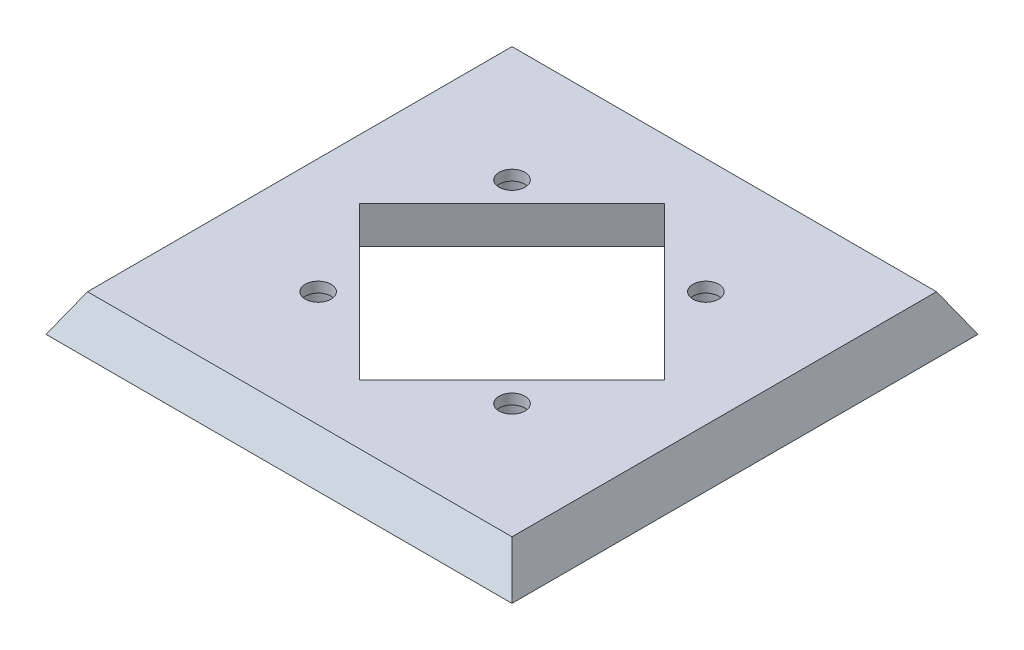
ISO-10303-21;
HEADER;
FILE_DESCRIPTION(('STEP AP214'),'2;1');
FILE_NAME('part.step','',(''),(''),'','','');
FILE_SCHEMA(('AUTOMOTIVE_DESIGN { 1 0 10303 214 1 1 1 1 }'));
ENDSEC;
DATA;
#1=APPLICATION_CONTEXT('core data for automotive mechanical design processes');
#2=APPLICATION_PROTOCOL_DEFINITION('international standard','automotive_design',2000,#1);
#3=PRODUCT_CONTEXT('',#1,'mechanical');
#4=PRODUCT('Part','Part','',(#3));
#5=PRODUCT_RELATED_PRODUCT_CATEGORY('part','',(#4));
#6=PRODUCT_DEFINITION_FORMATION('','',#4);
#7=PRODUCT_DEFINITION_CONTEXT('part definition',#1,'design');
#8=PRODUCT_DEFINITION('design','',#6,#7);
#9=PRODUCT_DEFINITION_SHAPE('','',#8);
#10=(LENGTH_UNIT() NAMED_UNIT(*) SI_UNIT(.MILLI.,.METRE.));
#11=(NAMED_UNIT(*) PLANE_ANGLE_UNIT() SI_UNIT($,.RADIAN.));
#12=(NAMED_UNIT(*) SI_UNIT($,.STERADIAN.) SOLID_ANGLE_UNIT());
#13=UNCERTAINTY_MEASURE_WITH_UNIT(LENGTH_MEASURE(1.E-05),#10,'distance_accuracy_value','');
#14=(GEOMETRIC_REPRESENTATION_CONTEXT(3) GLOBAL_UNCERTAINTY_ASSIGNED_CONTEXT((#13)) GLOBAL_UNIT_ASSIGNED_CONTEXT((#10,
#11,#12)) REPRESENTATION_CONTEXT('',''));
#15=CARTESIAN_POINT('',(0.,0.,0.));
#16=DIRECTION('',(0.,0.,1.));
#17=DIRECTION('',(1.,0.,0.));
#18=AXIS2_PLACEMENT_3D('',#15,#16,#17);
#19=CARTESIAN_POINT('',(-24.9999999999993,9.52499999999999,-24.9999999999993));
#20=DIRECTION('',(0.,-1.,0.));
#21=DIRECTION('',(0.,0.,-1.));
#22=AXIS2_PLACEMENT_3D('',#19,#20,#21);
#23=CYLINDRICAL_SURFACE('',#22,3.34);
#24=CARTESIAN_POINT('',(-24.9999999999993,9.52499999999999,-24.9999999999993));
#25=DIRECTION('',(0.,1.,0.));
#26=DIRECTION('',(0.,0.,1.));
#27=AXIS2_PLACEMENT_3D('',#24,#25,#26);
#28=CIRCLE('',#27,3.34);
#29=CARTESIAN_POINT('',(-24.9999999999993,9.52499999999999,-21.6599999999993));
#30=VERTEX_POINT('',#29);
#31=EDGE_CURVE('E124',#30,#30,#28,.T.);
#32=ORIENTED_EDGE('',*,*,#31,.T.);
#33=EDGE_LOOP('',(#32));
#34=FACE_BOUND('',#33,.T.);
#35=CARTESIAN_POINT('',(-24.9999999999993,6.858,-24.9999999999993));
#36=DIRECTION('',(0.,-1.,0.));
#37=DIRECTION('',(0.,0.,-1.));
#38=AXIS2_PLACEMENT_3D('',#35,#36,#37);
#39=CIRCLE('',#38,3.34);
#40=CARTESIAN_POINT('',(-24.9999999999993,6.858,-28.3399999999993));
#41=VERTEX_POINT('',#40);
#42=EDGE_CURVE('E45',#41,#41,#39,.T.);
#43=ORIENTED_EDGE('',*,*,#42,.T.);
#44=EDGE_LOOP('',(#43));
#45=FACE_BOUND('',#44,.T.);
#46=ADVANCED_FACE('F41',(#34,#45),#23,.F.);
#47=CARTESIAN_POINT('',(-24.9999999999979,9.52499999999999,25.0000000000007));
#48=DIRECTION('',(0.,-1.,0.));
#49=DIRECTION('',(0.,0.,-1.));
#50=AXIS2_PLACEMENT_3D('',#47,#48,#49);
#51=CYLINDRICAL_SURFACE('',#50,3.34);
#52=CARTESIAN_POINT('',(-24.9999999999979,9.52499999999999,25.0000000000007));
#53=DIRECTION('',(0.,1.,0.));
#54=DIRECTION('',(0.,0.,1.));
#55=AXIS2_PLACEMENT_3D('',#52,#53,#54);
#56=CIRCLE('',#55,3.34);
#57=CARTESIAN_POINT('',(-24.9999999999979,9.52499999999999,28.3400000000007));
#58=VERTEX_POINT('',#57);
#59=EDGE_CURVE('E187',#58,#58,#56,.T.);
#60=ORIENTED_EDGE('',*,*,#59,.T.);
#61=EDGE_LOOP('',(#60));
#62=FACE_BOUND('',#61,.T.);
#63=CARTESIAN_POINT('',(-24.9999999999979,6.858,25.0000000000007));
#64=DIRECTION('',(0.,-1.,0.));
#65=DIRECTION('',(0.,0.,-1.));
#66=AXIS2_PLACEMENT_3D('',#63,#64,#65);
#67=CIRCLE('',#66,3.34);
#68=CARTESIAN_POINT('',(-24.9999999999979,6.858,21.6600000000007));
#69=VERTEX_POINT('',#68);
#70=EDGE_CURVE('E182',#69,#69,#67,.T.);
#71=ORIENTED_EDGE('',*,*,#70,.T.);
#72=EDGE_LOOP('',(#71));
#73=FACE_BOUND('',#72,.T.);
#74=ADVANCED_FACE('F219',(#62,#73),#51,.F.);
#75=CARTESIAN_POINT('',(25.0000000000021,9.52499999999999,24.9999999999993));
#76=DIRECTION('',(0.,-1.,0.));
#77=DIRECTION('',(0.,0.,-1.));
#78=AXIS2_PLACEMENT_3D('',#75,#76,#77);
#79=CYLINDRICAL_SURFACE('',#78,3.34);
#80=CARTESIAN_POINT('',(25.0000000000021,9.52499999999999,24.9999999999993));
#81=DIRECTION('',(0.,1.,0.));
#82=DIRECTION('',(0.,0.,1.));
#83=AXIS2_PLACEMENT_3D('',#80,#81,#82);
#84=CIRCLE('',#83,3.34);
#85=CARTESIAN_POINT('',(25.0000000000021,9.52499999999999,28.3399999999993));
#86=VERTEX_POINT('',#85);
#87=EDGE_CURVE('E191',#86,#86,#84,.T.);
#88=ORIENTED_EDGE('',*,*,#87,.T.);
#89=EDGE_LOOP('',(#88));
#90=FACE_BOUND('',#89,.T.);
#91=CARTESIAN_POINT('',(25.0000000000021,6.858,24.9999999999993));
#92=DIRECTION('',(0.,-1.,0.));
#93=DIRECTION('',(0.,0.,-1.));
#94=AXIS2_PLACEMENT_3D('',#91,#92,#93);
#95=CIRCLE('',#94,3.34);
#96=CARTESIAN_POINT('',(25.0000000000021,6.858,21.6599999999993));
#97=VERTEX_POINT('',#96);
#98=EDGE_CURVE('E179',#97,#97,#95,.T.);
#99=ORIENTED_EDGE('',*,*,#98,.T.);
#100=EDGE_LOOP('',(#99));
#101=FACE_BOUND('',#100,.T.);
#102=ADVANCED_FACE('F226',(#90,#101),#79,.F.);
#103=CARTESIAN_POINT('',(25.0000000000007,9.52499999999999,-25.0000000000007));
#104=DIRECTION('',(0.,-1.,0.));
#105=DIRECTION('',(0.,0.,-1.));
#106=AXIS2_PLACEMENT_3D('',#103,#104,#105);
#107=CYLINDRICAL_SURFACE('',#106,3.34);
#108=CARTESIAN_POINT('',(25.0000000000007,9.52499999999999,-25.0000000000007));
#109=DIRECTION('',(0.,1.,0.));
#110=DIRECTION('',(0.,0.,1.));
#111=AXIS2_PLACEMENT_3D('',#108,#109,#110);
#112=CIRCLE('',#111,3.34);
#113=CARTESIAN_POINT('',(25.0000000000007,9.52499999999999,-21.6600000000007));
#114=VERTEX_POINT('',#113);
#115=EDGE_CURVE('E138',#114,#114,#112,.T.);
#116=ORIENTED_EDGE('',*,*,#115,.T.);
#117=EDGE_LOOP('',(#116));
#118=FACE_BOUND('',#117,.T.);
#119=CARTESIAN_POINT('',(25.0000000000007,6.858,-25.0000000000007));
#120=DIRECTION('',(0.,-1.,0.));
#121=DIRECTION('',(0.,0.,-1.));
#122=AXIS2_PLACEMENT_3D('',#119,#120,#121);
#123=CIRCLE('',#122,3.34);
#124=CARTESIAN_POINT('',(25.0000000000007,6.858,-28.3400000000007));
#125=VERTEX_POINT('',#124);
#126=EDGE_CURVE('E176',#125,#125,#123,.T.);
#127=ORIENTED_EDGE('',*,*,#126,.T.);
#128=EDGE_LOOP('',(#127));
#129=FACE_BOUND('',#128,.T.);
#130=ADVANCED_FACE('F201',(#118,#129),#107,.F.);
#131=CARTESIAN_POINT('',(-60.1,-1.94289029309402E-13,60.1));
#132=DIRECTION('',(0.,0.489717903709931,0.871880940717224));
#133=DIRECTION('',(0.,-0.871880940717224,0.489717903709931));
#134=AXIS2_PLACEMENT_3D('',#131,#132,#133);
#135=PLANE('',#134);
#136=DIRECTION('',(0.43981093998604,0.783027888479835,-0.439810939986044));
#137=VECTOR('',#136,1.);
#138=CARTESIAN_POINT('',(-60.1,-1.94289029309402E-13,60.1));
#139=LINE('',#138,#137);
#140=CARTESIAN_POINT('',(-60.1,-1.94289029309402E-13,60.1));
#141=VERTEX_POINT('',#140);
#142=CARTESIAN_POINT('',(-54.75,9.52499999999999,54.75));
#143=VERTEX_POINT('',#142);
#144=EDGE_CURVE('E161',#141,#143,#139,.T.);
#145=ORIENTED_EDGE('',*,*,#144,.F.);
#146=DIRECTION('',(1.,0.,0.));
#147=VECTOR('',#146,1.);
#148=CARTESIAN_POINT('',(-60.1,-1.94289029309402E-13,60.1));
#149=LINE('',#148,#147);
#150=CARTESIAN_POINT('',(60.1,-1.94289029309402E-13,60.1));
#151=VERTEX_POINT('',#150);
#152=EDGE_CURVE('E167',#141,#151,#149,.T.);
#153=ORIENTED_EDGE('',*,*,#152,.T.);
#154=DIRECTION('',(0.43981093998604,-0.783027888479835,0.439810939986044));
#155=VECTOR('',#154,1.);
#156=CARTESIAN_POINT('',(36.8492737156452,41.3949846464454,36.849273715645));
#157=LINE('',#156,#155);
#158=CARTESIAN_POINT('',(54.75,9.52499999999999,54.75));
#159=VERTEX_POINT('',#158);
#160=EDGE_CURVE('E157',#159,#151,#157,.T.);
#161=ORIENTED_EDGE('',*,*,#160,.F.);
#162=DIRECTION('',(1.,0.,0.));
#163=VECTOR('',#162,1.);
#164=CARTESIAN_POINT('',(-60.1,9.52499999999999,54.75));
#165=LINE('',#164,#163);
#166=EDGE_CURVE('E11',#143,#159,#165,.T.);
#167=ORIENTED_EDGE('',*,*,#166,.F.);
#168=EDGE_LOOP('',(#145,#153,#161,#167));
#169=FACE_BOUND('',#168,.T.);
#170=ADVANCED_FACE('F43',(#169),#135,.T.);
#171=CARTESIAN_POINT('',(-60.1,9.52499999999999,54.75));
#172=DIRECTION('',(0.,1.,0.));
#173=DIRECTION('',(0.,0.,1.));
#174=AXIS2_PLACEMENT_3D('',#171,#172,#173);
#175=PLANE('',#174);
#176=ORIENTED_EDGE('',*,*,#115,.F.);
#177=EDGE_LOOP('',(#176));
#178=FACE_BOUND('',#177,.T.);
#179=DIRECTION('',(0.707106781186548,0.,-0.707106781186548));
#180=VECTOR('',#179,1.);
#181=CARTESIAN_POINT('',(0.,9.52499999999999,39.3575634408432));
#182=LINE('',#181,#180);
#183=CARTESIAN_POINT('',(0.,9.52499999999999,39.3575634408432));
#184=VERTEX_POINT('',#183);
#185=CARTESIAN_POINT('',(39.3575634408432,9.52499999999999,0.));
#186=VERTEX_POINT('',#185);
#187=EDGE_CURVE('E116',#184,#186,#182,.T.);
#188=ORIENTED_EDGE('',*,*,#187,.F.);
#189=DIRECTION('',(0.707106781186548,0.,0.707106781186548));
#190=VECTOR('',#189,1.);
#191=CARTESIAN_POINT('',(-39.3575634408432,9.52499999999999,0.));
#192=LINE('',#191,#190);
#193=CARTESIAN_POINT('',(-39.3575634408432,9.52499999999999,0.));
#194=VERTEX_POINT('',#193);
#195=EDGE_CURVE('E108',#194,#184,#192,.T.);
#196=ORIENTED_EDGE('',*,*,#195,.F.);
#197=DIRECTION('',(-0.707106781186548,0.,0.707106781186547));
#198=VECTOR('',#197,1.);
#199=CARTESIAN_POINT('',(-39.3575634408432,9.52499999999999,0.));
#200=LINE('',#199,#198);
#201=CARTESIAN_POINT('',(0.,9.52499999999999,-39.3575634408432));
#202=VERTEX_POINT('',#201);
#203=EDGE_CURVE('E132',#202,#194,#200,.T.);
#204=ORIENTED_EDGE('',*,*,#203,.F.);
#205=DIRECTION('',(-0.707106781186548,0.,-0.707106781186547));
#206=VECTOR('',#205,1.);
#207=CARTESIAN_POINT('',(0.,9.52499999999999,-39.3575634408432));
#208=LINE('',#207,#206);
#209=EDGE_CURVE('E130',#186,#202,#208,.T.);
#210=ORIENTED_EDGE('',*,*,#209,.F.);
#211=EDGE_LOOP('',(#188,#196,#204,#210));
#212=FACE_BOUND('',#211,.T.);
#213=ORIENTED_EDGE('',*,*,#87,.F.);
#214=EDGE_LOOP('',(#213));
#215=FACE_BOUND('',#214,.T.);
#216=ORIENTED_EDGE('',*,*,#59,.F.);
#217=EDGE_LOOP('',(#216));
#218=FACE_BOUND('',#217,.T.);
#219=ORIENTED_EDGE('',*,*,#31,.F.);
#220=EDGE_LOOP('',(#219));
#221=FACE_BOUND('',#220,.T.);
#222=DIRECTION('',(0.,0.,1.));
#223=VECTOR('',#222,1.);
#224=CARTESIAN_POINT('',(-54.75,9.52499999999999,-60.1));
#225=LINE('',#224,#223);
#226=CARTESIAN_POINT('',(-54.75,9.52499999999999,-54.75));
#227=VERTEX_POINT('',#226);
#228=EDGE_CURVE('E151',#227,#143,#225,.T.);
#229=ORIENTED_EDGE('',*,*,#228,.T.);
#230=ORIENTED_EDGE('',*,*,#166,.T.);
#231=DIRECTION('',(0.,0.,1.));
#232=VECTOR('',#231,1.);
#233=CARTESIAN_POINT('',(54.75,9.52499999999999,-60.1));
#234=LINE('',#233,#232);
#235=CARTESIAN_POINT('',(54.75,9.52499999999999,-54.75));
#236=VERTEX_POINT('',#235);
#237=EDGE_CURVE('E150',#236,#159,#234,.T.);
#238=ORIENTED_EDGE('',*,*,#237,.F.);
#239=DIRECTION('',(1.,0.,0.));
#240=VECTOR('',#239,1.);
#241=CARTESIAN_POINT('',(-60.1,9.52499999999999,-54.75));
#242=LINE('',#241,#240);
#243=EDGE_CURVE('E50',#227,#236,#242,.T.);
#244=ORIENTED_EDGE('',*,*,#243,.F.);
#245=EDGE_LOOP('',(#229,#230,#238,#244));
#246=FACE_BOUND('',#245,.T.);
#247=ADVANCED_FACE('F128',(#178,#212,#215,#218,#221,#246),#175,.T.);
#248=CARTESIAN_POINT('',(-60.1,9.52499999999999,-54.75));
#249=DIRECTION('',(0.,0.489717903709931,-0.871880940717224));
#250=DIRECTION('',(0.,0.871880940717224,0.489717903709931));
#251=AXIS2_PLACEMENT_3D('',#248,#249,#250);
#252=PLANE('',#251);
#253=DIRECTION('',(-0.43981093998604,-0.783027888479835,-0.439810939986044));
#254=VECTOR('',#253,1.);
#255=CARTESIAN_POINT('',(-55.784870096683,7.68254436057832,-55.784870096683));
#256=LINE('',#255,#254);
#257=CARTESIAN_POINT('',(-60.1,-1.94289029309402E-13,-60.1));
#258=VERTEX_POINT('',#257);
#259=EDGE_CURVE('E159',#227,#258,#256,.T.);
#260=ORIENTED_EDGE('',*,*,#259,.F.);
#261=ORIENTED_EDGE('',*,*,#243,.T.);
#262=DIRECTION('',(-0.43981093998604,0.783027888479835,0.439810939986044));
#263=VECTOR('',#262,1.);
#264=CARTESIAN_POINT('',(32.5341438123282,49.0775290070239,-32.534143812328));
#265=LINE('',#264,#263);
#266=CARTESIAN_POINT('',(60.1,-1.94289029309402E-13,-60.1));
#267=VERTEX_POINT('',#266);
#268=EDGE_CURVE('E154',#267,#236,#265,.T.);
#269=ORIENTED_EDGE('',*,*,#268,.F.);
#270=DIRECTION('',(1.,0.,0.));
#271=VECTOR('',#270,1.);
#272=CARTESIAN_POINT('',(-60.1,-1.94289029309402E-13,-60.1));
#273=LINE('',#272,#271);
#274=EDGE_CURVE('E171',#258,#267,#273,.T.);
#275=ORIENTED_EDGE('',*,*,#274,.F.);
#276=EDGE_LOOP('',(#260,#261,#269,#275));
#277=FACE_BOUND('',#276,.T.);
#278=ADVANCED_FACE('F205',(#277),#252,.T.);
#279=CARTESIAN_POINT('',(-60.1,-1.94289029309402E-13,-60.1));
#280=DIRECTION('',(0.,-1.,0.));
#281=DIRECTION('',(0.,0.,-1.));
#282=AXIS2_PLACEMENT_3D('',#279,#280,#281);
#283=PLANE('',#282);
#284=CARTESIAN_POINT('',(-25.000000000001,0.,-24.9999999999976));
#285=DIRECTION('',(0.,-1.,0.));
#286=DIRECTION('',(0.,0.,-1.));
#287=AXIS2_PLACEMENT_3D('',#284,#285,#286);
#288=CIRCLE('',#287,5.08);
#289=CARTESIAN_POINT('',(-25.000000000001,0.,-30.0799999999976));
#290=VERTEX_POINT('',#289);
#291=EDGE_CURVE('E259',#290,#290,#288,.T.);
#292=ORIENTED_EDGE('',*,*,#291,.F.);
#293=EDGE_LOOP('',(#292));
#294=FACE_BOUND('',#293,.T.);
#295=CARTESIAN_POINT('',(24.9999999999977,0.,-25.0000000000009));
#296=DIRECTION('',(0.,-1.,0.));
#297=DIRECTION('',(0.,0.,-1.));
#298=AXIS2_PLACEMENT_3D('',#295,#296,#297);
#299=CIRCLE('',#298,5.08);
#300=CARTESIAN_POINT('',(24.9999999999977,0.,-30.0800000000009));
#301=VERTEX_POINT('',#300);
#302=EDGE_CURVE('E263',#301,#301,#299,.T.);
#303=ORIENTED_EDGE('',*,*,#302,.F.);
#304=EDGE_LOOP('',(#303));
#305=FACE_BOUND('',#304,.T.);
#306=CARTESIAN_POINT('',(25.0000000000008,0.,24.9999999999978));
#307=DIRECTION('',(0.,-1.,0.));
#308=DIRECTION('',(0.,0.,-1.));
#309=AXIS2_PLACEMENT_3D('',#306,#307,#308);
#310=CIRCLE('',#309,5.08);
#311=CARTESIAN_POINT('',(25.0000000000008,0.,19.9199999999978));
#312=VERTEX_POINT('',#311);
#313=EDGE_CURVE('E267',#312,#312,#310,.T.);
#314=ORIENTED_EDGE('',*,*,#313,.F.);
#315=EDGE_LOOP('',(#314));
#316=FACE_BOUND('',#315,.T.);
#317=CARTESIAN_POINT('',(-24.9999999999979,0.,25.0000000000007));
#318=DIRECTION('',(0.,-1.,0.));
#319=DIRECTION('',(0.,0.,-1.));
#320=AXIS2_PLACEMENT_3D('',#317,#318,#319);
#321=CIRCLE('',#320,5.08);
#322=CARTESIAN_POINT('',(-24.9999999999979,0.,19.9200000000007));
#323=VERTEX_POINT('',#322);
#324=EDGE_CURVE('E271',#323,#323,#321,.T.);
#325=ORIENTED_EDGE('',*,*,#324,.F.);
#326=EDGE_LOOP('',(#325));
#327=FACE_BOUND('',#326,.T.);
#328=DIRECTION('',(-0.707106781186548,0.,0.707106781186547));
#329=VECTOR('',#328,1.);
#330=CARTESIAN_POINT('',(-39.3575634408432,0.,0.));
#331=LINE('',#330,#329);
#332=CARTESIAN_POINT('',(0.,0.,-39.3575634408432));
#333=VERTEX_POINT('',#332);
#334=CARTESIAN_POINT('',(-39.3575634408432,-1.94289029309402E-13,0.));
#335=VERTEX_POINT('',#334);
#336=EDGE_CURVE('E117',#333,#335,#331,.T.);
#337=ORIENTED_EDGE('',*,*,#336,.T.);
#338=DIRECTION('',(0.707106781186548,0.,0.707106781186548));
#339=VECTOR('',#338,1.);
#340=CARTESIAN_POINT('',(-39.3575634408432,0.,0.));
#341=LINE('',#340,#339);
#342=CARTESIAN_POINT('',(0.,0.,39.3575634408432));
#343=VERTEX_POINT('',#342);
#344=EDGE_CURVE('E66',#335,#343,#341,.T.);
#345=ORIENTED_EDGE('',*,*,#344,.T.);
#346=DIRECTION('',(0.707106781186548,0.,-0.707106781186548));
#347=VECTOR('',#346,1.);
#348=CARTESIAN_POINT('',(0.,0.,39.3575634408432));
#349=LINE('',#348,#347);
#350=CARTESIAN_POINT('',(39.3575634408432,0.,0.));
#351=VERTEX_POINT('',#350);
#352=EDGE_CURVE('E123',#343,#351,#349,.T.);
#353=ORIENTED_EDGE('',*,*,#352,.T.);
#354=DIRECTION('',(-0.707106781186548,0.,-0.707106781186547));
#355=VECTOR('',#354,1.);
#356=CARTESIAN_POINT('',(0.,0.,-39.3575634408432));
#357=LINE('',#356,#355);
#358=EDGE_CURVE('E140',#351,#333,#357,.T.);
#359=ORIENTED_EDGE('',*,*,#358,.T.);
#360=EDGE_LOOP('',(#337,#345,#353,#359));
#361=FACE_BOUND('',#360,.T.);
#362=ORIENTED_EDGE('',*,*,#274,.T.);
#363=DIRECTION('',(0.,0.,-1.));
#364=VECTOR('',#363,1.);
#365=CARTESIAN_POINT('',(60.1,-1.94289029309402E-13,-60.1));
#366=LINE('',#365,#364);
#367=EDGE_CURVE('E163',#151,#267,#366,.T.);
#368=ORIENTED_EDGE('',*,*,#367,.F.);
#369=ORIENTED_EDGE('',*,*,#152,.F.);
#370=DIRECTION('',(0.,0.,-1.));
#371=VECTOR('',#370,1.);
#372=CARTESIAN_POINT('',(-60.1,-1.94289029309402E-13,-60.1));
#373=LINE('',#372,#371);
#374=EDGE_CURVE('E165',#141,#258,#373,.T.);
#375=ORIENTED_EDGE('',*,*,#374,.T.);
#376=EDGE_LOOP('',(#362,#368,#369,#375));
#377=FACE_BOUND('',#376,.T.);
#378=ADVANCED_FACE('F212',(#294,#305,#316,#327,#361,#377),#283,.T.);
#379=CARTESIAN_POINT('',(54.75,9.52499999999999,-60.1));
#380=DIRECTION('',(-0.871880940717225,-0.489717903709928,0.));
#381=DIRECTION('',(0.489717903709928,-0.871880940717225,0.));
#382=AXIS2_PLACEMENT_3D('',#379,#380,#381);
#383=PLANE('',#382);
#384=ORIENTED_EDGE('',*,*,#160,.T.);
#385=ORIENTED_EDGE('',*,*,#367,.T.);
#386=ORIENTED_EDGE('',*,*,#268,.T.);
#387=ORIENTED_EDGE('',*,*,#237,.T.);
#388=EDGE_LOOP('',(#384,#385,#386,#387));
#389=FACE_BOUND('',#388,.T.);
#390=ADVANCED_FACE('F232',(#389),#383,.F.);
#391=CARTESIAN_POINT('',(-54.75,9.52499999999999,-60.1));
#392=DIRECTION('',(0.871880940717225,-0.489717903709928,0.));
#393=DIRECTION('',(0.489717903709928,0.871880940717225,0.));
#394=AXIS2_PLACEMENT_3D('',#391,#392,#393);
#395=PLANE('',#394);
#396=ORIENTED_EDGE('',*,*,#144,.T.);
#397=ORIENTED_EDGE('',*,*,#228,.F.);
#398=ORIENTED_EDGE('',*,*,#259,.T.);
#399=ORIENTED_EDGE('',*,*,#374,.F.);
#400=EDGE_LOOP('',(#396,#397,#398,#399));
#401=FACE_BOUND('',#400,.T.);
#402=ADVANCED_FACE('F231',(#401),#395,.F.);
#403=CARTESIAN_POINT('',(-39.3575634408432,9.52499999999999,0.));
#404=DIRECTION('',(0.707106781186547,0.,-0.707106781186547));
#405=DIRECTION('',(-0.707106781186548,0.,-0.707106781186547));
#406=AXIS2_PLACEMENT_3D('',#403,#404,#405);
#407=PLANE('',#406);
#408=ORIENTED_EDGE('',*,*,#344,.F.);
#409=DIRECTION('',(0.,-1.,0.));
#410=VECTOR('',#409,1.);
#411=CARTESIAN_POINT('',(-39.3575634408432,9.52499999999999,0.));
#412=LINE('',#411,#410);
#413=EDGE_CURVE('E112',#194,#335,#412,.T.);
#414=ORIENTED_EDGE('',*,*,#413,.F.);
#415=ORIENTED_EDGE('',*,*,#195,.T.);
#416=DIRECTION('',(0.,-1.,0.));
#417=VECTOR('',#416,1.);
#418=CARTESIAN_POINT('',(0.,9.52499999999999,39.3575634408432));
#419=LINE('',#418,#417);
#420=EDGE_CURVE('E111',#184,#343,#419,.T.);
#421=ORIENTED_EDGE('',*,*,#420,.T.);
#422=EDGE_LOOP('',(#408,#414,#415,#421));
#423=FACE_BOUND('',#422,.T.);
#424=ADVANCED_FACE('F110',(#423),#407,.T.);
#425=CARTESIAN_POINT('',(0.,9.52499999999999,39.3575634408432));
#426=DIRECTION('',(-0.707106781186548,0.,-0.707106781186548));
#427=DIRECTION('',(-0.707106781186548,0.,0.707106781186548));
#428=AXIS2_PLACEMENT_3D('',#425,#426,#427);
#429=PLANE('',#428);
#430=ORIENTED_EDGE('',*,*,#352,.F.);
#431=ORIENTED_EDGE('',*,*,#420,.F.);
#432=ORIENTED_EDGE('',*,*,#187,.T.);
#433=DIRECTION('',(0.,-1.,0.));
#434=VECTOR('',#433,1.);
#435=CARTESIAN_POINT('',(39.3575634408432,9.52499999999999,0.));
#436=LINE('',#435,#434);
#437=EDGE_CURVE('E125',#186,#351,#436,.T.);
#438=ORIENTED_EDGE('',*,*,#437,.T.);
#439=EDGE_LOOP('',(#430,#431,#432,#438));
#440=FACE_BOUND('',#439,.T.);
#441=ADVANCED_FACE('F120',(#440),#429,.T.);
#442=CARTESIAN_POINT('',(0.,9.52499999999999,-39.3575634408432));
#443=DIRECTION('',(-0.707106781186547,0.,0.707106781186548));
#444=DIRECTION('',(0.707106781186548,0.,0.707106781186547));
#445=AXIS2_PLACEMENT_3D('',#442,#443,#444);
#446=PLANE('',#445);
#447=ORIENTED_EDGE('',*,*,#358,.F.);
#448=ORIENTED_EDGE('',*,*,#437,.F.);
#449=ORIENTED_EDGE('',*,*,#209,.T.);
#450=DIRECTION('',(0.,-1.,0.));
#451=VECTOR('',#450,1.);
#452=CARTESIAN_POINT('',(0.,9.52499999999999,-39.3575634408432));
#453=LINE('',#452,#451);
#454=EDGE_CURVE('E58',#202,#333,#453,.T.);
#455=ORIENTED_EDGE('',*,*,#454,.T.);
#456=EDGE_LOOP('',(#447,#448,#449,#455));
#457=FACE_BOUND('',#456,.T.);
#458=ADVANCED_FACE('F275',(#457),#446,.T.);
#459=CARTESIAN_POINT('',(-39.3575634408432,9.52499999999999,0.));
#460=DIRECTION('',(0.707106781186547,0.,0.707106781186548));
#461=DIRECTION('',(0.707106781186548,0.,-0.707106781186547));
#462=AXIS2_PLACEMENT_3D('',#459,#460,#461);
#463=PLANE('',#462);
#464=ORIENTED_EDGE('',*,*,#336,.F.);
#465=ORIENTED_EDGE('',*,*,#454,.F.);
#466=ORIENTED_EDGE('',*,*,#203,.T.);
#467=ORIENTED_EDGE('',*,*,#413,.T.);
#468=EDGE_LOOP('',(#464,#465,#466,#467));
#469=FACE_BOUND('',#468,.T.);
#470=ADVANCED_FACE('F273',(#469),#463,.T.);
#471=CARTESIAN_POINT('',(24.9999999999977,6.858,-25.0000000000009));
#472=DIRECTION('',(0.,-1.,0.));
#473=DIRECTION('',(0.,0.,-1.));
#474=AXIS2_PLACEMENT_3D('',#471,#472,#473);
#475=CYLINDRICAL_SURFACE('',#474,5.08);
#476=CARTESIAN_POINT('',(24.9999999999977,6.858,-25.0000000000009));
#477=DIRECTION('',(0.,-1.,0.));
#478=DIRECTION('',(0.,0.,-1.));
#479=AXIS2_PLACEMENT_3D('',#476,#477,#478);
#480=CIRCLE('',#479,5.08);
#481=CARTESIAN_POINT('',(24.9999999999977,6.858,-30.0800000000009));
#482=VERTEX_POINT('',#481);
#483=EDGE_CURVE('E401',#482,#482,#480,.T.);
#484=ORIENTED_EDGE('',*,*,#483,.F.);
#485=EDGE_LOOP('',(#484));
#486=FACE_BOUND('',#485,.T.);
#487=ORIENTED_EDGE('',*,*,#302,.T.);
#488=EDGE_LOOP('',(#487));
#489=FACE_BOUND('',#488,.T.);
#490=ADVANCED_FACE('F274',(#486,#489),#475,.F.);
#491=CARTESIAN_POINT('',(24.9999999999977,6.858,-25.0000000000009));
#492=DIRECTION('',(0.,-1.,0.));
#493=DIRECTION('',(0.,0.,-1.));
#494=AXIS2_PLACEMENT_3D('',#491,#492,#493);
#495=PLANE('',#494);
#496=ORIENTED_EDGE('',*,*,#126,.F.);
#497=EDGE_LOOP('',(#496));
#498=FACE_BOUND('',#497,.T.);
#499=ORIENTED_EDGE('',*,*,#483,.T.);
#500=EDGE_LOOP('',(#499));
#501=FACE_BOUND('',#500,.T.);
#502=ADVANCED_FACE('F280',(#498,#501),#495,.T.);
#503=CARTESIAN_POINT('',(25.0000000000008,6.858,24.9999999999978));
#504=DIRECTION('',(0.,-1.,0.));
#505=DIRECTION('',(0.,0.,-1.));
#506=AXIS2_PLACEMENT_3D('',#503,#504,#505);
#507=CYLINDRICAL_SURFACE('',#506,5.08);
#508=CARTESIAN_POINT('',(25.0000000000008,6.858,24.9999999999978));
#509=DIRECTION('',(0.,-1.,0.));
#510=DIRECTION('',(0.,0.,-1.));
#511=AXIS2_PLACEMENT_3D('',#508,#509,#510);
#512=CIRCLE('',#511,5.08);
#513=CARTESIAN_POINT('',(25.0000000000008,6.858,19.9199999999978));
#514=VERTEX_POINT('',#513);
#515=EDGE_CURVE('E407',#514,#514,#512,.T.);
#516=ORIENTED_EDGE('',*,*,#515,.F.);
#517=EDGE_LOOP('',(#516));
#518=FACE_BOUND('',#517,.T.);
#519=ORIENTED_EDGE('',*,*,#313,.T.);
#520=EDGE_LOOP('',(#519));
#521=FACE_BOUND('',#520,.T.);
#522=ADVANCED_FACE('F333',(#518,#521),#507,.F.);
#523=CARTESIAN_POINT('',(25.0000000000008,6.858,24.9999999999978));
#524=DIRECTION('',(0.,-1.,0.));
#525=DIRECTION('',(0.,0.,-1.));
#526=AXIS2_PLACEMENT_3D('',#523,#524,#525);
#527=PLANE('',#526);
#528=ORIENTED_EDGE('',*,*,#98,.F.);
#529=EDGE_LOOP('',(#528));
#530=FACE_BOUND('',#529,.T.);
#531=ORIENTED_EDGE('',*,*,#515,.T.);
#532=EDGE_LOOP('',(#531));
#533=FACE_BOUND('',#532,.T.);
#534=ADVANCED_FACE('F343',(#530,#533),#527,.T.);
#535=CARTESIAN_POINT('',(-24.9999999999979,6.858,25.0000000000007));
#536=DIRECTION('',(0.,-1.,0.));
#537=DIRECTION('',(0.,0.,-1.));
#538=AXIS2_PLACEMENT_3D('',#535,#536,#537);
#539=CYLINDRICAL_SURFACE('',#538,5.08);
#540=CARTESIAN_POINT('',(-24.9999999999979,6.858,25.0000000000007));
#541=DIRECTION('',(0.,-1.,0.));
#542=DIRECTION('',(0.,0.,-1.));
#543=AXIS2_PLACEMENT_3D('',#540,#541,#542);
#544=CIRCLE('',#543,5.08);
#545=CARTESIAN_POINT('',(-24.9999999999979,6.858,19.9200000000007));
#546=VERTEX_POINT('',#545);
#547=EDGE_CURVE('E180',#546,#546,#544,.T.);
#548=ORIENTED_EDGE('',*,*,#547,.F.);
#549=EDGE_LOOP('',(#548));
#550=FACE_BOUND('',#549,.T.);
#551=ORIENTED_EDGE('',*,*,#324,.T.);
#552=EDGE_LOOP('',(#551));
#553=FACE_BOUND('',#552,.T.);
#554=ADVANCED_FACE('F353',(#550,#553),#539,.F.);
#555=CARTESIAN_POINT('',(-24.9999999999979,6.858,25.0000000000007));
#556=DIRECTION('',(0.,-1.,0.));
#557=DIRECTION('',(0.,0.,-1.));
#558=AXIS2_PLACEMENT_3D('',#555,#556,#557);
#559=PLANE('',#558);
#560=ORIENTED_EDGE('',*,*,#70,.F.);
#561=EDGE_LOOP('',(#560));
#562=FACE_BOUND('',#561,.T.);
#563=ORIENTED_EDGE('',*,*,#547,.T.);
#564=EDGE_LOOP('',(#563));
#565=FACE_BOUND('',#564,.T.);
#566=ADVANCED_FACE('F363',(#562,#565),#559,.T.);
#567=CARTESIAN_POINT('',(-25.000000000001,6.858,-24.9999999999976));
#568=DIRECTION('',(0.,-1.,0.));
#569=DIRECTION('',(0.,0.,-1.));
#570=AXIS2_PLACEMENT_3D('',#567,#568,#569);
#571=CYLINDRICAL_SURFACE('',#570,5.08);
#572=CARTESIAN_POINT('',(-25.000000000001,6.858,-24.9999999999976));
#573=DIRECTION('',(0.,-1.,0.));
#574=DIRECTION('',(0.,0.,-1.));
#575=AXIS2_PLACEMENT_3D('',#572,#573,#574);
#576=CIRCLE('',#575,5.08);
#577=CARTESIAN_POINT('',(-25.000000000001,6.858,-30.0799999999976));
#578=VERTEX_POINT('',#577);
#579=EDGE_CURVE('E399',#578,#578,#576,.T.);
#580=ORIENTED_EDGE('',*,*,#579,.F.);
#581=EDGE_LOOP('',(#580));
#582=FACE_BOUND('',#581,.T.);
#583=ORIENTED_EDGE('',*,*,#291,.T.);
#584=EDGE_LOOP('',(#583));
#585=FACE_BOUND('',#584,.T.);
#586=ADVANCED_FACE('F373',(#582,#585),#571,.F.);
#587=CARTESIAN_POINT('',(-25.000000000001,6.858,-24.9999999999976));
#588=DIRECTION('',(0.,-1.,0.));
#589=DIRECTION('',(0.,0.,-1.));
#590=AXIS2_PLACEMENT_3D('',#587,#588,#589);
#591=PLANE('',#590);
#592=ORIENTED_EDGE('',*,*,#42,.F.);
#593=EDGE_LOOP('',(#592));
#594=FACE_BOUND('',#593,.T.);
#595=ORIENTED_EDGE('',*,*,#579,.T.);
#596=EDGE_LOOP('',(#595));
#597=FACE_BOUND('',#596,.T.);
#598=ADVANCED_FACE('F383',(#594,#597),#591,.T.);
#599=CLOSED_SHELL('',(#46,#74,#102,#130,#170,#247,#278,#378,#390,#402,#424,#441,#458,#470,#490,
#502,#522,#534,#554,#566,#586,#598));
#600=MANIFOLD_SOLID_BREP('B2',#599);
#601=ADVANCED_BREP_SHAPE_REPRESENTATION('',(#18,#600),#14);
#602=SHAPE_DEFINITION_REPRESENTATION(#9,#601);
ENDSEC;
END-ISO-10303-21;
